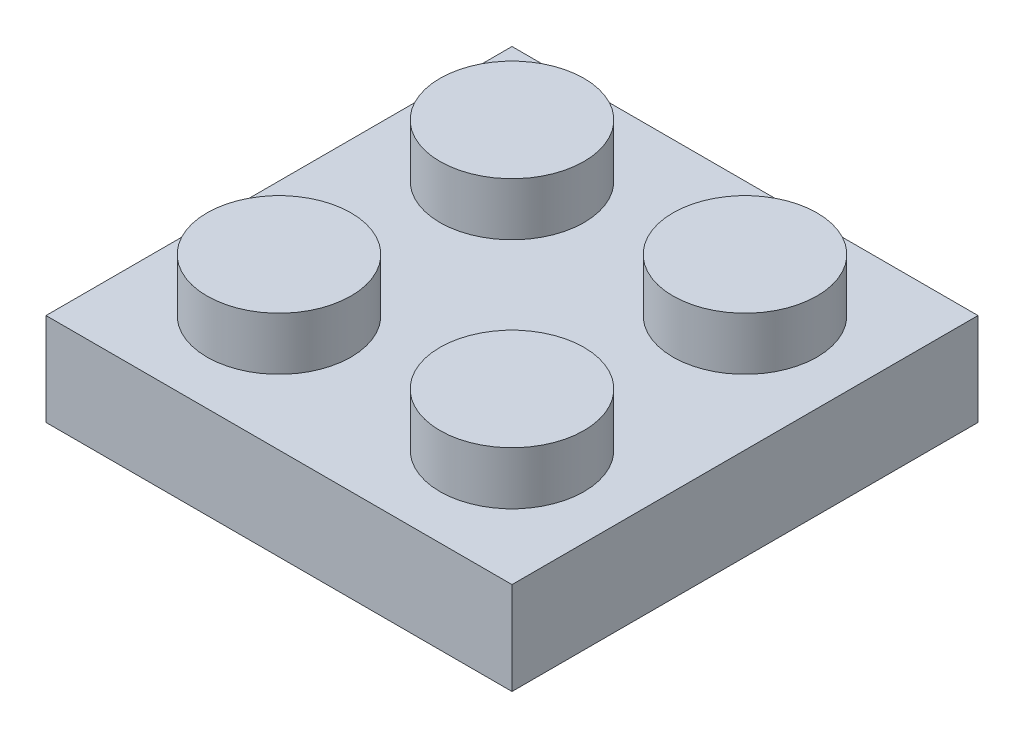
ISO-10303-21;
HEADER;
FILE_DESCRIPTION(('STEP AP214'),'2;1');
FILE_NAME('part.step','',(''),(''),'','','');
FILE_SCHEMA(('AUTOMOTIVE_DESIGN { 1 0 10303 214 1 1 1 1 }'));
ENDSEC;
DATA;
#1=APPLICATION_CONTEXT('core data for automotive mechanical design processes');
#2=APPLICATION_PROTOCOL_DEFINITION('international standard','automotive_design',2000,#1);
#3=PRODUCT_CONTEXT('',#1,'mechanical');
#4=PRODUCT('Part','Part','',(#3));
#5=PRODUCT_RELATED_PRODUCT_CATEGORY('part','',(#4));
#6=PRODUCT_DEFINITION_FORMATION('','',#4);
#7=PRODUCT_DEFINITION_CONTEXT('part definition',#1,'design');
#8=PRODUCT_DEFINITION('design','',#6,#7);
#9=PRODUCT_DEFINITION_SHAPE('','',#8);
#10=(LENGTH_UNIT() NAMED_UNIT(*) SI_UNIT(.MILLI.,.METRE.));
#11=(NAMED_UNIT(*) PLANE_ANGLE_UNIT() SI_UNIT($,.RADIAN.));
#12=(NAMED_UNIT(*) SI_UNIT($,.STERADIAN.) SOLID_ANGLE_UNIT());
#13=UNCERTAINTY_MEASURE_WITH_UNIT(LENGTH_MEASURE(1.E-05),#10,'distance_accuracy_value','');
#14=(GEOMETRIC_REPRESENTATION_CONTEXT(3) GLOBAL_UNCERTAINTY_ASSIGNED_CONTEXT((#13)) GLOBAL_UNIT_ASSIGNED_CONTEXT((#10,
#11,#12)) REPRESENTATION_CONTEXT('',''));
#15=CARTESIAN_POINT('',(0.,0.,0.));
#16=DIRECTION('',(0.,0.,1.));
#17=DIRECTION('',(1.,0.,0.));
#18=AXIS2_PLACEMENT_3D('',#15,#16,#17);
#19=CARTESIAN_POINT('',(7.925,-3.15,-7.925));
#20=DIRECTION('',(1.,0.,0.));
#21=DIRECTION('',(0.,0.,-1.));
#22=AXIS2_PLACEMENT_3D('',#19,#20,#21);
#23=PLANE('',#22);
#24=DIRECTION('',(0.,0.,-1.));
#25=VECTOR('',#24,1.);
#26=CARTESIAN_POINT('',(7.925,0.,-7.925));
#27=LINE('',#26,#25);
#28=CARTESIAN_POINT('',(7.925,0.,7.925));
#29=VERTEX_POINT('',#28);
#30=CARTESIAN_POINT('',(7.925,0.,-7.925));
#31=VERTEX_POINT('',#30);
#32=EDGE_CURVE('E194',#29,#31,#27,.T.);
#33=ORIENTED_EDGE('',*,*,#32,.F.);
#34=DIRECTION('',(0.,1.,0.));
#35=VECTOR('',#34,1.);
#36=CARTESIAN_POINT('',(7.925,-3.15,7.925));
#37=LINE('',#36,#35);
#38=CARTESIAN_POINT('',(7.925,-3.15,7.925));
#39=VERTEX_POINT('',#38);
#40=EDGE_CURVE('E42',#39,#29,#37,.T.);
#41=ORIENTED_EDGE('',*,*,#40,.F.);
#42=DIRECTION('',(0.,0.,-1.));
#43=VECTOR('',#42,1.);
#44=CARTESIAN_POINT('',(7.925,-3.15,-7.925));
#45=LINE('',#44,#43);
#46=CARTESIAN_POINT('',(7.925,-3.15,-7.925));
#47=VERTEX_POINT('',#46);
#48=EDGE_CURVE('E197',#39,#47,#45,.T.);
#49=ORIENTED_EDGE('',*,*,#48,.T.);
#50=DIRECTION('',(0.,1.,0.));
#51=VECTOR('',#50,1.);
#52=CARTESIAN_POINT('',(7.925,-3.15,-7.925));
#53=LINE('',#52,#51);
#54=EDGE_CURVE('E83',#47,#31,#53,.T.);
#55=ORIENTED_EDGE('',*,*,#54,.T.);
#56=EDGE_LOOP('',(#33,#41,#49,#55));
#57=FACE_BOUND('',#56,.T.);
#58=ADVANCED_FACE('F35',(#57),#23,.T.);
#59=CARTESIAN_POINT('',(-7.925,-3.15,7.925));
#60=DIRECTION('',(0.,0.,1.));
#61=DIRECTION('',(1.,0.,0.));
#62=AXIS2_PLACEMENT_3D('',#59,#60,#61);
#63=PLANE('',#62);
#64=DIRECTION('',(1.,0.,0.));
#65=VECTOR('',#64,1.);
#66=CARTESIAN_POINT('',(-7.925,0.,7.925));
#67=LINE('',#66,#65);
#68=CARTESIAN_POINT('',(-7.925,0.,7.925));
#69=VERTEX_POINT('',#68);
#70=EDGE_CURVE('E200',#69,#29,#67,.T.);
#71=ORIENTED_EDGE('',*,*,#70,.F.);
#72=DIRECTION('',(0.,1.,0.));
#73=VECTOR('',#72,1.);
#74=CARTESIAN_POINT('',(-7.925,-3.15,7.925));
#75=LINE('',#74,#73);
#76=CARTESIAN_POINT('',(-7.925,-3.15,7.925));
#77=VERTEX_POINT('',#76);
#78=EDGE_CURVE('E218',#77,#69,#75,.T.);
#79=ORIENTED_EDGE('',*,*,#78,.F.);
#80=DIRECTION('',(1.,0.,0.));
#81=VECTOR('',#80,1.);
#82=CARTESIAN_POINT('',(-7.925,-3.15,7.925));
#83=LINE('',#82,#81);
#84=EDGE_CURVE('E205',#77,#39,#83,.T.);
#85=ORIENTED_EDGE('',*,*,#84,.T.);
#86=ORIENTED_EDGE('',*,*,#40,.T.);
#87=EDGE_LOOP('',(#71,#79,#85,#86));
#88=FACE_BOUND('',#87,.T.);
#89=ADVANCED_FACE('F225',(#88),#63,.T.);
#90=CARTESIAN_POINT('',(-7.925,-3.15,-7.925));
#91=DIRECTION('',(-1.,0.,0.));
#92=DIRECTION('',(0.,0.,1.));
#93=AXIS2_PLACEMENT_3D('',#90,#91,#92);
#94=PLANE('',#93);
#95=DIRECTION('',(0.,0.,1.));
#96=VECTOR('',#95,1.);
#97=CARTESIAN_POINT('',(-7.925,0.,-7.925));
#98=LINE('',#97,#96);
#99=CARTESIAN_POINT('',(-7.925,0.,-7.925));
#100=VERTEX_POINT('',#99);
#101=EDGE_CURVE('E212',#100,#69,#98,.T.);
#102=ORIENTED_EDGE('',*,*,#101,.F.);
#103=DIRECTION('',(0.,1.,0.));
#104=VECTOR('',#103,1.);
#105=CARTESIAN_POINT('',(-7.925,-3.15,-7.925));
#106=LINE('',#105,#104);
#107=CARTESIAN_POINT('',(-7.925,-3.15,-7.925));
#108=VERTEX_POINT('',#107);
#109=EDGE_CURVE('E220',#108,#100,#106,.T.);
#110=ORIENTED_EDGE('',*,*,#109,.F.);
#111=DIRECTION('',(0.,0.,1.));
#112=VECTOR('',#111,1.);
#113=CARTESIAN_POINT('',(-7.925,-3.15,-7.925));
#114=LINE('',#113,#112);
#115=EDGE_CURVE('E202',#108,#77,#114,.T.);
#116=ORIENTED_EDGE('',*,*,#115,.T.);
#117=ORIENTED_EDGE('',*,*,#78,.T.);
#118=EDGE_LOOP('',(#102,#110,#116,#117));
#119=FACE_BOUND('',#118,.T.);
#120=ADVANCED_FACE('F229',(#119),#94,.T.);
#121=CARTESIAN_POINT('',(-7.925,-3.15,-7.925));
#122=DIRECTION('',(0.,0.,-1.));
#123=DIRECTION('',(-1.,0.,0.));
#124=AXIS2_PLACEMENT_3D('',#121,#122,#123);
#125=PLANE('',#124);
#126=DIRECTION('',(-1.,0.,0.));
#127=VECTOR('',#126,1.);
#128=CARTESIAN_POINT('',(-7.925,0.,-7.925));
#129=LINE('',#128,#127);
#130=EDGE_CURVE('E209',#31,#100,#129,.T.);
#131=ORIENTED_EDGE('',*,*,#130,.F.);
#132=ORIENTED_EDGE('',*,*,#54,.F.);
#133=DIRECTION('',(-1.,0.,0.));
#134=VECTOR('',#133,1.);
#135=CARTESIAN_POINT('',(-7.925,-3.15,-7.925));
#136=LINE('',#135,#134);
#137=EDGE_CURVE('E199',#47,#108,#136,.T.);
#138=ORIENTED_EDGE('',*,*,#137,.T.);
#139=ORIENTED_EDGE('',*,*,#109,.T.);
#140=EDGE_LOOP('',(#131,#132,#138,#139));
#141=FACE_BOUND('',#140,.T.);
#142=ADVANCED_FACE('F221',(#141),#125,.T.);
#143=CARTESIAN_POINT('',(0.,-3.15,0.));
#144=DIRECTION('',(0.,1.,0.));
#145=DIRECTION('',(0.,0.,1.));
#146=AXIS2_PLACEMENT_3D('',#143,#144,#145);
#147=PLANE('',#146);
#148=DIRECTION('',(1.,0.,0.));
#149=VECTOR('',#148,1.);
#150=CARTESIAN_POINT('',(0.,-3.15,6.425));
#151=LINE('',#150,#149);
#152=CARTESIAN_POINT('',(-6.425,-3.15,6.425));
#153=VERTEX_POINT('',#152);
#154=CARTESIAN_POINT('',(6.425,-3.15,6.425));
#155=VERTEX_POINT('',#154);
#156=EDGE_CURVE('E168',#153,#155,#151,.T.);
#157=ORIENTED_EDGE('',*,*,#156,.T.);
#158=DIRECTION('',(0.,0.,-1.));
#159=VECTOR('',#158,1.);
#160=CARTESIAN_POINT('',(6.425,-3.15,0.));
#161=LINE('',#160,#159);
#162=CARTESIAN_POINT('',(6.425,-3.15,-6.425));
#163=VERTEX_POINT('',#162);
#164=EDGE_CURVE('E112',#155,#163,#161,.T.);
#165=ORIENTED_EDGE('',*,*,#164,.T.);
#166=DIRECTION('',(-1.,0.,0.));
#167=VECTOR('',#166,1.);
#168=CARTESIAN_POINT('',(0.,-3.15,-6.425));
#169=LINE('',#168,#167);
#170=CARTESIAN_POINT('',(-6.425,-3.15,-6.425));
#171=VERTEX_POINT('',#170);
#172=EDGE_CURVE('E134',#163,#171,#169,.T.);
#173=ORIENTED_EDGE('',*,*,#172,.T.);
#174=DIRECTION('',(0.,0.,1.));
#175=VECTOR('',#174,1.);
#176=CARTESIAN_POINT('',(-6.425,-3.15,0.));
#177=LINE('',#176,#175);
#178=EDGE_CURVE('E49',#171,#153,#177,.T.);
#179=ORIENTED_EDGE('',*,*,#178,.T.);
#180=EDGE_LOOP('',(#157,#165,#173,#179));
#181=FACE_BOUND('',#180,.T.);
#182=ORIENTED_EDGE('',*,*,#48,.F.);
#183=ORIENTED_EDGE('',*,*,#84,.F.);
#184=ORIENTED_EDGE('',*,*,#115,.F.);
#185=ORIENTED_EDGE('',*,*,#137,.F.);
#186=EDGE_LOOP('',(#182,#183,#184,#185));
#187=FACE_BOUND('',#186,.T.);
#188=ADVANCED_FACE('F231',(#181,#187),#147,.F.);
#189=CARTESIAN_POINT('',(0.,0.,0.));
#190=DIRECTION('',(0.,1.,0.));
#191=DIRECTION('',(0.,0.,1.));
#192=AXIS2_PLACEMENT_3D('',#189,#190,#191);
#193=PLANE('',#192);
#194=CARTESIAN_POINT('',(3.9625,0.,3.9625));
#195=DIRECTION('',(0.,1.,0.));
#196=DIRECTION('',(0.,0.,1.));
#197=AXIS2_PLACEMENT_3D('',#194,#195,#196);
#198=CIRCLE('',#197,2.45);
#199=CARTESIAN_POINT('',(3.9625,0.,6.4125));
#200=VERTEX_POINT('',#199);
#201=EDGE_CURVE('E117',#200,#200,#198,.T.);
#202=ORIENTED_EDGE('',*,*,#201,.F.);
#203=EDGE_LOOP('',(#202));
#204=FACE_BOUND('',#203,.T.);
#205=CARTESIAN_POINT('',(3.9625,0.,-3.9625));
#206=DIRECTION('',(0.,1.,0.));
#207=DIRECTION('',(0.,0.,1.));
#208=AXIS2_PLACEMENT_3D('',#205,#206,#207);
#209=CIRCLE('',#208,2.45);
#210=CARTESIAN_POINT('',(3.9625,0.,-1.5125));
#211=VERTEX_POINT('',#210);
#212=EDGE_CURVE('E176',#211,#211,#209,.T.);
#213=ORIENTED_EDGE('',*,*,#212,.F.);
#214=EDGE_LOOP('',(#213));
#215=FACE_BOUND('',#214,.T.);
#216=CARTESIAN_POINT('',(-3.9625,0.,3.9625));
#217=DIRECTION('',(0.,1.,0.));
#218=DIRECTION('',(0.,0.,1.));
#219=AXIS2_PLACEMENT_3D('',#216,#217,#218);
#220=CIRCLE('',#219,2.45);
#221=CARTESIAN_POINT('',(-3.9625,0.,6.4125));
#222=VERTEX_POINT('',#221);
#223=EDGE_CURVE('E182',#222,#222,#220,.T.);
#224=ORIENTED_EDGE('',*,*,#223,.F.);
#225=EDGE_LOOP('',(#224));
#226=FACE_BOUND('',#225,.T.);
#227=CARTESIAN_POINT('',(-3.9625,0.,-3.9625));
#228=DIRECTION('',(0.,1.,0.));
#229=DIRECTION('',(0.,0.,1.));
#230=AXIS2_PLACEMENT_3D('',#227,#228,#229);
#231=CIRCLE('',#230,2.45);
#232=CARTESIAN_POINT('',(-3.9625,0.,-1.5125));
#233=VERTEX_POINT('',#232);
#234=EDGE_CURVE('E188',#233,#233,#231,.T.);
#235=ORIENTED_EDGE('',*,*,#234,.F.);
#236=EDGE_LOOP('',(#235));
#237=FACE_BOUND('',#236,.T.);
#238=ORIENTED_EDGE('',*,*,#32,.T.);
#239=ORIENTED_EDGE('',*,*,#130,.T.);
#240=ORIENTED_EDGE('',*,*,#101,.T.);
#241=ORIENTED_EDGE('',*,*,#70,.T.);
#242=EDGE_LOOP('',(#238,#239,#240,#241));
#243=FACE_BOUND('',#242,.T.);
#244=ADVANCED_FACE('F224',(#204,#215,#226,#237,#243),#193,.T.);
#245=CARTESIAN_POINT('',(-3.9625,1.8,-3.9625));
#246=DIRECTION('',(0.,-1.,0.));
#247=DIRECTION('',(0.,0.,-1.));
#248=AXIS2_PLACEMENT_3D('',#245,#246,#247);
#249=CYLINDRICAL_SURFACE('',#248,2.45);
#250=CARTESIAN_POINT('',(-3.9625,1.8,-3.9625));
#251=DIRECTION('',(0.,1.,0.));
#252=DIRECTION('',(0.,0.,1.));
#253=AXIS2_PLACEMENT_3D('',#250,#251,#252);
#254=CIRCLE('',#253,2.45);
#255=CARTESIAN_POINT('',(-3.9625,1.8,-1.5125));
#256=VERTEX_POINT('',#255);
#257=EDGE_CURVE('E191',#256,#256,#254,.T.);
#258=ORIENTED_EDGE('',*,*,#257,.F.);
#259=EDGE_LOOP('',(#258));
#260=FACE_BOUND('',#259,.T.);
#261=ORIENTED_EDGE('',*,*,#234,.T.);
#262=EDGE_LOOP('',(#261));
#263=FACE_BOUND('',#262,.T.);
#264=ADVANCED_FACE('F239',(#260,#263),#249,.T.);
#265=CARTESIAN_POINT('',(-3.9625,1.8,-3.9625));
#266=DIRECTION('',(0.,1.,0.));
#267=DIRECTION('',(0.,0.,1.));
#268=AXIS2_PLACEMENT_3D('',#265,#266,#267);
#269=PLANE('',#268);
#270=ORIENTED_EDGE('',*,*,#257,.T.);
#271=EDGE_LOOP('',(#270));
#272=FACE_BOUND('',#271,.T.);
#273=ADVANCED_FACE('F274',(#272),#269,.T.);
#274=CARTESIAN_POINT('',(-3.9625,1.8,3.9625));
#275=DIRECTION('',(0.,-1.,0.));
#276=DIRECTION('',(0.,0.,-1.));
#277=AXIS2_PLACEMENT_3D('',#274,#275,#276);
#278=CYLINDRICAL_SURFACE('',#277,2.45);
#279=CARTESIAN_POINT('',(-3.9625,1.8,3.9625));
#280=DIRECTION('',(0.,1.,0.));
#281=DIRECTION('',(0.,0.,1.));
#282=AXIS2_PLACEMENT_3D('',#279,#280,#281);
#283=CIRCLE('',#282,2.45);
#284=CARTESIAN_POINT('',(-3.9625,1.8,6.4125));
#285=VERTEX_POINT('',#284);
#286=EDGE_CURVE('E185',#285,#285,#283,.T.);
#287=ORIENTED_EDGE('',*,*,#286,.F.);
#288=EDGE_LOOP('',(#287));
#289=FACE_BOUND('',#288,.T.);
#290=ORIENTED_EDGE('',*,*,#223,.T.);
#291=EDGE_LOOP('',(#290));
#292=FACE_BOUND('',#291,.T.);
#293=ADVANCED_FACE('F283',(#289,#292),#278,.T.);
#294=CARTESIAN_POINT('',(-3.9625,1.8,3.9625));
#295=DIRECTION('',(0.,1.,0.));
#296=DIRECTION('',(0.,0.,1.));
#297=AXIS2_PLACEMENT_3D('',#294,#295,#296);
#298=PLANE('',#297);
#299=ORIENTED_EDGE('',*,*,#286,.T.);
#300=EDGE_LOOP('',(#299));
#301=FACE_BOUND('',#300,.T.);
#302=ADVANCED_FACE('F293',(#301),#298,.T.);
#303=CARTESIAN_POINT('',(3.9625,1.8,-3.9625));
#304=DIRECTION('',(0.,-1.,0.));
#305=DIRECTION('',(0.,0.,-1.));
#306=AXIS2_PLACEMENT_3D('',#303,#304,#305);
#307=CYLINDRICAL_SURFACE('',#306,2.45);
#308=CARTESIAN_POINT('',(3.9625,1.8,-3.9625));
#309=DIRECTION('',(0.,1.,0.));
#310=DIRECTION('',(0.,0.,1.));
#311=AXIS2_PLACEMENT_3D('',#308,#309,#310);
#312=CIRCLE('',#311,2.45);
#313=CARTESIAN_POINT('',(3.9625,1.8,-1.5125));
#314=VERTEX_POINT('',#313);
#315=EDGE_CURVE('E179',#314,#314,#312,.T.);
#316=ORIENTED_EDGE('',*,*,#315,.F.);
#317=EDGE_LOOP('',(#316));
#318=FACE_BOUND('',#317,.T.);
#319=ORIENTED_EDGE('',*,*,#212,.T.);
#320=EDGE_LOOP('',(#319));
#321=FACE_BOUND('',#320,.T.);
#322=ADVANCED_FACE('F303',(#318,#321),#307,.T.);
#323=CARTESIAN_POINT('',(3.9625,1.8,-3.9625));
#324=DIRECTION('',(0.,1.,0.));
#325=DIRECTION('',(0.,0.,1.));
#326=AXIS2_PLACEMENT_3D('',#323,#324,#325);
#327=PLANE('',#326);
#328=ORIENTED_EDGE('',*,*,#315,.T.);
#329=EDGE_LOOP('',(#328));
#330=FACE_BOUND('',#329,.T.);
#331=ADVANCED_FACE('F313',(#330),#327,.T.);
#332=CARTESIAN_POINT('',(3.9625,1.8,3.9625));
#333=DIRECTION('',(0.,-1.,0.));
#334=DIRECTION('',(0.,0.,-1.));
#335=AXIS2_PLACEMENT_3D('',#332,#333,#334);
#336=CYLINDRICAL_SURFACE('',#335,2.45);
#337=CARTESIAN_POINT('',(3.9625,1.8,3.9625));
#338=DIRECTION('',(0.,1.,0.));
#339=DIRECTION('',(0.,0.,1.));
#340=AXIS2_PLACEMENT_3D('',#337,#338,#339);
#341=CIRCLE('',#340,2.45);
#342=CARTESIAN_POINT('',(3.9625,1.8,6.4125));
#343=VERTEX_POINT('',#342);
#344=EDGE_CURVE('E173',#343,#343,#341,.T.);
#345=ORIENTED_EDGE('',*,*,#344,.F.);
#346=EDGE_LOOP('',(#345));
#347=FACE_BOUND('',#346,.T.);
#348=ORIENTED_EDGE('',*,*,#201,.T.);
#349=EDGE_LOOP('',(#348));
#350=FACE_BOUND('',#349,.T.);
#351=ADVANCED_FACE('F323',(#347,#350),#336,.T.);
#352=CARTESIAN_POINT('',(3.9625,1.8,3.9625));
#353=DIRECTION('',(0.,1.,0.));
#354=DIRECTION('',(0.,0.,1.));
#355=AXIS2_PLACEMENT_3D('',#352,#353,#354);
#356=PLANE('',#355);
#357=ORIENTED_EDGE('',*,*,#344,.T.);
#358=EDGE_LOOP('',(#357));
#359=FACE_BOUND('',#358,.T.);
#360=ADVANCED_FACE('F333',(#359),#356,.T.);
#361=CARTESIAN_POINT('',(6.425,-3.15,-7.925));
#362=DIRECTION('',(1.,0.,0.));
#363=DIRECTION('',(0.,0.,-1.));
#364=AXIS2_PLACEMENT_3D('',#361,#362,#363);
#365=PLANE('',#364);
#366=DIRECTION('',(0.,0.,-1.));
#367=VECTOR('',#366,1.);
#368=CARTESIAN_POINT('',(6.425,-1.5,0.));
#369=LINE('',#368,#367);
#370=CARTESIAN_POINT('',(6.425,-1.5,6.425));
#371=VERTEX_POINT('',#370);
#372=CARTESIAN_POINT('',(6.425,-1.5,-6.425));
#373=VERTEX_POINT('',#372);
#374=EDGE_CURVE('E110',#371,#373,#369,.T.);
#375=ORIENTED_EDGE('',*,*,#374,.T.);
#376=DIRECTION('',(0.,1.,0.));
#377=VECTOR('',#376,1.);
#378=CARTESIAN_POINT('',(6.425,-3.15,-6.425));
#379=LINE('',#378,#377);
#380=EDGE_CURVE('E139',#163,#373,#379,.T.);
#381=ORIENTED_EDGE('',*,*,#380,.F.);
#382=ORIENTED_EDGE('',*,*,#164,.F.);
#383=DIRECTION('',(0.,1.,0.));
#384=VECTOR('',#383,1.);
#385=CARTESIAN_POINT('',(6.425,-3.15,6.425));
#386=LINE('',#385,#384);
#387=EDGE_CURVE('E107',#155,#371,#386,.T.);
#388=ORIENTED_EDGE('',*,*,#387,.T.);
#389=EDGE_LOOP('',(#375,#381,#382,#388));
#390=FACE_BOUND('',#389,.T.);
#391=ADVANCED_FACE('F109',(#390),#365,.F.);
#392=CARTESIAN_POINT('',(-7.925,-3.15,6.425));
#393=DIRECTION('',(0.,0.,1.));
#394=DIRECTION('',(1.,0.,0.));
#395=AXIS2_PLACEMENT_3D('',#392,#393,#394);
#396=PLANE('',#395);
#397=DIRECTION('',(1.,0.,0.));
#398=VECTOR('',#397,1.);
#399=CARTESIAN_POINT('',(0.,-1.5,6.425));
#400=LINE('',#399,#398);
#401=CARTESIAN_POINT('',(-6.425,-1.5,6.425));
#402=VERTEX_POINT('',#401);
#403=EDGE_CURVE('E125',#402,#371,#400,.T.);
#404=ORIENTED_EDGE('',*,*,#403,.T.);
#405=ORIENTED_EDGE('',*,*,#387,.F.);
#406=ORIENTED_EDGE('',*,*,#156,.F.);
#407=DIRECTION('',(0.,1.,0.));
#408=VECTOR('',#407,1.);
#409=CARTESIAN_POINT('',(-6.425,-3.15,6.425));
#410=LINE('',#409,#408);
#411=EDGE_CURVE('E118',#153,#402,#410,.T.);
#412=ORIENTED_EDGE('',*,*,#411,.T.);
#413=EDGE_LOOP('',(#404,#405,#406,#412));
#414=FACE_BOUND('',#413,.T.);
#415=ADVANCED_FACE('F130',(#414),#396,.F.);
#416=CARTESIAN_POINT('',(-6.425,-3.15,-7.925));
#417=DIRECTION('',(-1.,0.,0.));
#418=DIRECTION('',(0.,0.,1.));
#419=AXIS2_PLACEMENT_3D('',#416,#417,#418);
#420=PLANE('',#419);
#421=DIRECTION('',(0.,0.,1.));
#422=VECTOR('',#421,1.);
#423=CARTESIAN_POINT('',(-6.425,-1.5,0.));
#424=LINE('',#423,#422);
#425=CARTESIAN_POINT('',(-6.425,-1.5,-6.425));
#426=VERTEX_POINT('',#425);
#427=EDGE_CURVE('E132',#426,#402,#424,.T.);
#428=ORIENTED_EDGE('',*,*,#427,.T.);
#429=ORIENTED_EDGE('',*,*,#411,.F.);
#430=ORIENTED_EDGE('',*,*,#178,.F.);
#431=DIRECTION('',(0.,1.,0.));
#432=VECTOR('',#431,1.);
#433=CARTESIAN_POINT('',(-6.425,-3.15,-6.425));
#434=LINE('',#433,#432);
#435=EDGE_CURVE('E140',#171,#426,#434,.T.);
#436=ORIENTED_EDGE('',*,*,#435,.T.);
#437=EDGE_LOOP('',(#428,#429,#430,#436));
#438=FACE_BOUND('',#437,.T.);
#439=ADVANCED_FACE('F363',(#438),#420,.F.);
#440=CARTESIAN_POINT('',(-7.925,-3.15,-6.425));
#441=DIRECTION('',(0.,0.,-1.));
#442=DIRECTION('',(-1.,0.,0.));
#443=AXIS2_PLACEMENT_3D('',#440,#441,#442);
#444=PLANE('',#443);
#445=DIRECTION('',(-1.,0.,0.));
#446=VECTOR('',#445,1.);
#447=CARTESIAN_POINT('',(0.,-1.5,-6.425));
#448=LINE('',#447,#446);
#449=EDGE_CURVE('E127',#373,#426,#448,.T.);
#450=ORIENTED_EDGE('',*,*,#449,.T.);
#451=ORIENTED_EDGE('',*,*,#435,.F.);
#452=ORIENTED_EDGE('',*,*,#172,.F.);
#453=ORIENTED_EDGE('',*,*,#380,.T.);
#454=EDGE_LOOP('',(#450,#451,#452,#453));
#455=FACE_BOUND('',#454,.T.);
#456=ADVANCED_FACE('F372',(#455),#444,.F.);
#457=CARTESIAN_POINT('',(0.,-1.5,0.));
#458=DIRECTION('',(0.,1.,0.));
#459=DIRECTION('',(0.,0.,1.));
#460=AXIS2_PLACEMENT_3D('',#457,#458,#459);
#461=PLANE('',#460);
#462=CARTESIAN_POINT('',(0.,-1.5,0.));
#463=DIRECTION('',(0.,1.,0.));
#464=DIRECTION('',(0.,0.,1.));
#465=AXIS2_PLACEMENT_3D('',#462,#463,#464);
#466=CIRCLE('',#465,3.25);
#467=CARTESIAN_POINT('',(0.,-1.5,3.25));
#468=VERTEX_POINT('',#467);
#469=EDGE_CURVE('E12',#468,#468,#466,.F.);
#470=ORIENTED_EDGE('',*,*,#469,.F.);
#471=EDGE_LOOP('',(#470));
#472=FACE_BOUND('',#471,.T.);
#473=CARTESIAN_POINT('',(3.9625,-1.5,3.9625));
#474=DIRECTION('',(0.,1.,0.));
#475=DIRECTION('',(0.,0.,1.));
#476=AXIS2_PLACEMENT_3D('',#473,#474,#475);
#477=CIRCLE('',#476,0.950000000000001);
#478=CARTESIAN_POINT('',(3.9625,-1.5,4.9125));
#479=VERTEX_POINT('',#478);
#480=EDGE_CURVE('E144',#479,#479,#477,.T.);
#481=ORIENTED_EDGE('',*,*,#480,.T.);
#482=EDGE_LOOP('',(#481));
#483=FACE_BOUND('',#482,.T.);
#484=CARTESIAN_POINT('',(3.9625,-1.5,-3.9625));
#485=DIRECTION('',(0.,1.,0.));
#486=DIRECTION('',(0.,0.,1.));
#487=AXIS2_PLACEMENT_3D('',#484,#485,#486);
#488=CIRCLE('',#487,0.95);
#489=CARTESIAN_POINT('',(3.9625,-1.5,-3.0125));
#490=VERTEX_POINT('',#489);
#491=EDGE_CURVE('E149',#490,#490,#488,.T.);
#492=ORIENTED_EDGE('',*,*,#491,.T.);
#493=EDGE_LOOP('',(#492));
#494=FACE_BOUND('',#493,.T.);
#495=CARTESIAN_POINT('',(-3.9625,-1.5,3.9625));
#496=DIRECTION('',(0.,1.,0.));
#497=DIRECTION('',(0.,0.,1.));
#498=AXIS2_PLACEMENT_3D('',#495,#496,#497);
#499=CIRCLE('',#498,0.950000000000001);
#500=CARTESIAN_POINT('',(-3.9625,-1.5,4.9125));
#501=VERTEX_POINT('',#500);
#502=EDGE_CURVE('E153',#501,#501,#499,.T.);
#503=ORIENTED_EDGE('',*,*,#502,.T.);
#504=EDGE_LOOP('',(#503));
#505=FACE_BOUND('',#504,.T.);
#506=CARTESIAN_POINT('',(-3.9625,-1.5,-3.9625));
#507=DIRECTION('',(0.,1.,0.));
#508=DIRECTION('',(0.,0.,1.));
#509=AXIS2_PLACEMENT_3D('',#506,#507,#508);
#510=CIRCLE('',#509,0.95);
#511=CARTESIAN_POINT('',(-3.9625,-1.5,-3.0125));
#512=VERTEX_POINT('',#511);
#513=EDGE_CURVE('E157',#512,#512,#510,.T.);
#514=ORIENTED_EDGE('',*,*,#513,.T.);
#515=EDGE_LOOP('',(#514));
#516=FACE_BOUND('',#515,.T.);
#517=ORIENTED_EDGE('',*,*,#374,.F.);
#518=ORIENTED_EDGE('',*,*,#403,.F.);
#519=ORIENTED_EDGE('',*,*,#427,.F.);
#520=ORIENTED_EDGE('',*,*,#449,.F.);
#521=EDGE_LOOP('',(#517,#518,#519,#520));
#522=FACE_BOUND('',#521,.T.);
#523=ADVANCED_FACE('F123',(#472,#483,#494,#505,#516,#522),#461,.F.);
#524=CARTESIAN_POINT('',(-3.9625,1.8,-3.9625));
#525=DIRECTION('',(0.,-1.,0.));
#526=DIRECTION('',(0.,0.,-1.));
#527=AXIS2_PLACEMENT_3D('',#524,#525,#526);
#528=CYLINDRICAL_SURFACE('',#527,0.95);
#529=CARTESIAN_POINT('',(-3.9625,0.3,-3.9625));
#530=DIRECTION('',(0.,1.,0.));
#531=DIRECTION('',(0.,0.,1.));
#532=AXIS2_PLACEMENT_3D('',#529,#530,#531);
#533=CIRCLE('',#532,0.95);
#534=CARTESIAN_POINT('',(-3.9625,0.3,-3.0125));
#535=VERTEX_POINT('',#534);
#536=EDGE_CURVE('E128',#535,#535,#533,.T.);
#537=ORIENTED_EDGE('',*,*,#536,.T.);
#538=EDGE_LOOP('',(#537));
#539=FACE_BOUND('',#538,.T.);
#540=ORIENTED_EDGE('',*,*,#513,.F.);
#541=EDGE_LOOP('',(#540));
#542=FACE_BOUND('',#541,.T.);
#543=ADVANCED_FACE('F388',(#539,#542),#528,.F.);
#544=CARTESIAN_POINT('',(-3.9625,0.3,-3.9625));
#545=DIRECTION('',(0.,1.,0.));
#546=DIRECTION('',(0.,0.,1.));
#547=AXIS2_PLACEMENT_3D('',#544,#545,#546);
#548=PLANE('',#547);
#549=ORIENTED_EDGE('',*,*,#536,.F.);
#550=EDGE_LOOP('',(#549));
#551=FACE_BOUND('',#550,.T.);
#552=ADVANCED_FACE('F393',(#551),#548,.F.);
#553=CARTESIAN_POINT('',(-3.9625,1.8,3.9625));
#554=DIRECTION('',(0.,-1.,0.));
#555=DIRECTION('',(0.,0.,-1.));
#556=AXIS2_PLACEMENT_3D('',#553,#554,#555);
#557=CYLINDRICAL_SURFACE('',#556,0.950000000000001);
#558=CARTESIAN_POINT('',(-3.9625,0.3,3.9625));
#559=DIRECTION('',(0.,1.,0.));
#560=DIRECTION('',(0.,0.,1.));
#561=AXIS2_PLACEMENT_3D('',#558,#559,#560);
#562=CIRCLE('',#561,0.950000000000001);
#563=CARTESIAN_POINT('',(-3.9625,0.3,4.9125));
#564=VERTEX_POINT('',#563);
#565=EDGE_CURVE('E156',#564,#564,#562,.T.);
#566=ORIENTED_EDGE('',*,*,#565,.T.);
#567=EDGE_LOOP('',(#566));
#568=FACE_BOUND('',#567,.T.);
#569=ORIENTED_EDGE('',*,*,#502,.F.);
#570=EDGE_LOOP('',(#569));
#571=FACE_BOUND('',#570,.T.);
#572=ADVANCED_FACE('F403',(#568,#571),#557,.F.);
#573=CARTESIAN_POINT('',(-3.9625,0.3,3.9625));
#574=DIRECTION('',(0.,1.,0.));
#575=DIRECTION('',(0.,0.,1.));
#576=AXIS2_PLACEMENT_3D('',#573,#574,#575);
#577=PLANE('',#576);
#578=ORIENTED_EDGE('',*,*,#565,.F.);
#579=EDGE_LOOP('',(#578));
#580=FACE_BOUND('',#579,.T.);
#581=ADVANCED_FACE('F413',(#580),#577,.F.);
#582=CARTESIAN_POINT('',(3.9625,1.8,-3.9625));
#583=DIRECTION('',(0.,-1.,0.));
#584=DIRECTION('',(0.,0.,-1.));
#585=AXIS2_PLACEMENT_3D('',#582,#583,#584);
#586=CYLINDRICAL_SURFACE('',#585,0.95);
#587=CARTESIAN_POINT('',(3.9625,0.3,-3.9625));
#588=DIRECTION('',(0.,1.,0.));
#589=DIRECTION('',(0.,0.,1.));
#590=AXIS2_PLACEMENT_3D('',#587,#588,#589);
#591=CIRCLE('',#590,0.95);
#592=CARTESIAN_POINT('',(3.9625,0.3,-3.0125));
#593=VERTEX_POINT('',#592);
#594=EDGE_CURVE('E152',#593,#593,#591,.T.);
#595=ORIENTED_EDGE('',*,*,#594,.T.);
#596=EDGE_LOOP('',(#595));
#597=FACE_BOUND('',#596,.T.);
#598=ORIENTED_EDGE('',*,*,#491,.F.);
#599=EDGE_LOOP('',(#598));
#600=FACE_BOUND('',#599,.T.);
#601=ADVANCED_FACE('F423',(#597,#600),#586,.F.);
#602=CARTESIAN_POINT('',(3.9625,0.3,-3.9625));
#603=DIRECTION('',(0.,1.,0.));
#604=DIRECTION('',(0.,0.,1.));
#605=AXIS2_PLACEMENT_3D('',#602,#603,#604);
#606=PLANE('',#605);
#607=ORIENTED_EDGE('',*,*,#594,.F.);
#608=EDGE_LOOP('',(#607));
#609=FACE_BOUND('',#608,.T.);
#610=ADVANCED_FACE('F433',(#609),#606,.F.);
#611=CARTESIAN_POINT('',(3.9625,1.8,3.9625));
#612=DIRECTION('',(0.,-1.,0.));
#613=DIRECTION('',(0.,0.,-1.));
#614=AXIS2_PLACEMENT_3D('',#611,#612,#613);
#615=CYLINDRICAL_SURFACE('',#614,0.950000000000001);
#616=CARTESIAN_POINT('',(3.9625,0.3,3.9625));
#617=DIRECTION('',(0.,1.,0.));
#618=DIRECTION('',(0.,0.,1.));
#619=AXIS2_PLACEMENT_3D('',#616,#617,#618);
#620=CIRCLE('',#619,0.950000000000001);
#621=CARTESIAN_POINT('',(3.9625,0.3,4.9125));
#622=VERTEX_POINT('',#621);
#623=EDGE_CURVE('E147',#622,#622,#620,.T.);
#624=ORIENTED_EDGE('',*,*,#623,.T.);
#625=EDGE_LOOP('',(#624));
#626=FACE_BOUND('',#625,.T.);
#627=ORIENTED_EDGE('',*,*,#480,.F.);
#628=EDGE_LOOP('',(#627));
#629=FACE_BOUND('',#628,.T.);
#630=ADVANCED_FACE('F443',(#626,#629),#615,.F.);
#631=CARTESIAN_POINT('',(3.9625,0.3,3.9625));
#632=DIRECTION('',(0.,1.,0.));
#633=DIRECTION('',(0.,0.,1.));
#634=AXIS2_PLACEMENT_3D('',#631,#632,#633);
#635=PLANE('',#634);
#636=ORIENTED_EDGE('',*,*,#623,.F.);
#637=EDGE_LOOP('',(#636));
#638=FACE_BOUND('',#637,.T.);
#639=ADVANCED_FACE('F453',(#638),#635,.F.);
#640=CARTESIAN_POINT('',(0.,-12.3423881554251,0.));
#641=DIRECTION('',(0.,1.,0.));
#642=DIRECTION('',(0.,0.,1.));
#643=AXIS2_PLACEMENT_3D('',#640,#641,#642);
#644=CYLINDRICAL_SURFACE('',#643,3.25);
#645=CARTESIAN_POINT('',(0.,-2.95,0.));
#646=DIRECTION('',(0.,1.,0.));
#647=DIRECTION('',(0.,0.,1.));
#648=AXIS2_PLACEMENT_3D('',#645,#646,#647);
#649=CIRCLE('',#648,3.25);
#650=CARTESIAN_POINT('',(0.,-2.95,3.25));
#651=VERTEX_POINT('',#650);
#652=EDGE_CURVE('E517',#651,#651,#649,.T.);
#653=ORIENTED_EDGE('',*,*,#652,.T.);
#654=EDGE_LOOP('',(#653));
#655=FACE_BOUND('',#654,.T.);
#656=ORIENTED_EDGE('',*,*,#469,.T.);
#657=EDGE_LOOP('',(#656));
#658=FACE_BOUND('',#657,.T.);
#659=ADVANCED_FACE('F463',(#655,#658),#644,.T.);
#660=CARTESIAN_POINT('',(0.,-12.3423881554251,0.));
#661=DIRECTION('',(0.,1.,0.));
#662=DIRECTION('',(0.,0.,1.));
#663=AXIS2_PLACEMENT_3D('',#660,#661,#662);
#664=CYLINDRICAL_SURFACE('',#663,2.45);
#665=CARTESIAN_POINT('',(0.,-2.95,0.));
#666=DIRECTION('',(0.,1.,0.));
#667=DIRECTION('',(0.,0.,1.));
#668=AXIS2_PLACEMENT_3D('',#665,#666,#667);
#669=CIRCLE('',#668,2.45);
#670=CARTESIAN_POINT('',(0.,-2.95,2.45));
#671=VERTEX_POINT('',#670);
#672=EDGE_CURVE('E148',#671,#671,#669,.T.);
#673=ORIENTED_EDGE('',*,*,#672,.F.);
#674=EDGE_LOOP('',(#673));
#675=FACE_BOUND('',#674,.T.);
#676=CARTESIAN_POINT('',(0.,-1.5,0.));
#677=DIRECTION('',(0.,-1.,0.));
#678=DIRECTION('',(0.,0.,-1.));
#679=AXIS2_PLACEMENT_3D('',#676,#677,#678);
#680=CIRCLE('',#679,2.45);
#681=CARTESIAN_POINT('',(0.,-1.5,-2.45));
#682=VERTEX_POINT('',#681);
#683=EDGE_CURVE('E515',#682,#682,#680,.T.);
#684=ORIENTED_EDGE('',*,*,#683,.F.);
#685=EDGE_LOOP('',(#684));
#686=FACE_BOUND('',#685,.T.);
#687=ADVANCED_FACE('F482',(#675,#686),#664,.F.);
#688=CARTESIAN_POINT('',(0.,-2.95,0.));
#689=DIRECTION('',(0.,1.,0.));
#690=DIRECTION('',(0.,0.,1.));
#691=AXIS2_PLACEMENT_3D('',#688,#689,#690);
#692=PLANE('',#691);
#693=ORIENTED_EDGE('',*,*,#672,.T.);
#694=EDGE_LOOP('',(#693));
#695=FACE_BOUND('',#694,.T.);
#696=ORIENTED_EDGE('',*,*,#652,.F.);
#697=EDGE_LOOP('',(#696));
#698=FACE_BOUND('',#697,.T.);
#699=ADVANCED_FACE('F492',(#695,#698),#692,.F.);
#700=ORIENTED_EDGE('',*,*,#683,.T.);
#701=EDGE_LOOP('',(#700));
#702=FACE_BOUND('',#701,.T.);
#703=ADVANCED_FACE('F475',(#702),#461,.F.);
#704=CLOSED_SHELL('',(#58,#89,#120,#142,#188,#244,#264,#273,#293,#302,#322,#331,#351,#360,#391,
#415,#439,#456,#523,#543,#552,#572,#581,#601,#610,#630,#639,#659,#687,#699,#703));
#705=MANIFOLD_SOLID_BREP('B2',#704);
#706=ADVANCED_BREP_SHAPE_REPRESENTATION('',(#18,#705),#14);
#707=SHAPE_DEFINITION_REPRESENTATION(#9,#706);
ENDSEC;
END-ISO-10303-21;
